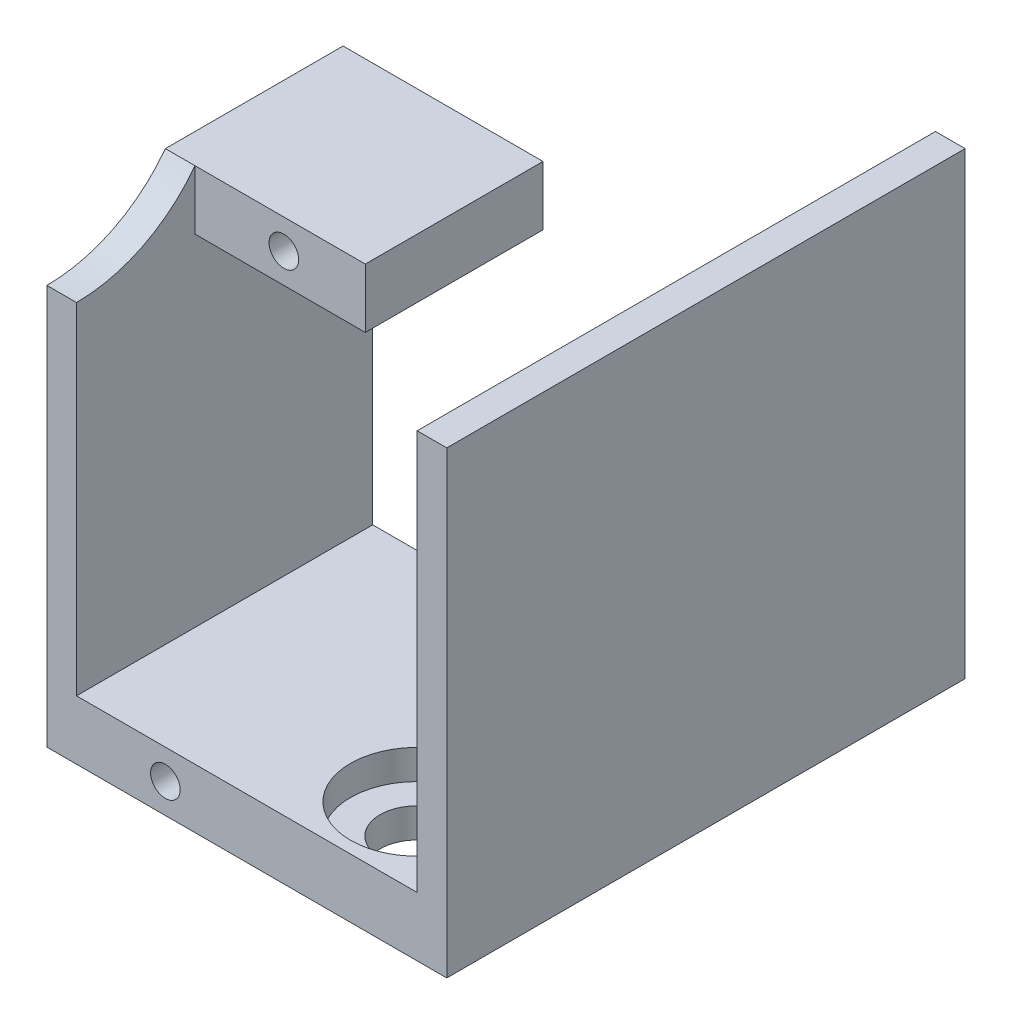
ISO-10303-21;
HEADER;
FILE_DESCRIPTION(('STEP AP214'),'2;1');
FILE_NAME('part.step','',(''),(''),'','','');
FILE_SCHEMA(('AUTOMOTIVE_DESIGN { 1 0 10303 214 1 1 1 1 }'));
ENDSEC;
DATA;
#1=APPLICATION_CONTEXT('core data for automotive mechanical design processes');
#2=APPLICATION_PROTOCOL_DEFINITION('international standard','automotive_design',2000,#1);
#3=PRODUCT_CONTEXT('',#1,'mechanical');
#4=PRODUCT('Part','Part','',(#3));
#5=PRODUCT_RELATED_PRODUCT_CATEGORY('part','',(#4));
#6=PRODUCT_DEFINITION_FORMATION('','',#4);
#7=PRODUCT_DEFINITION_CONTEXT('part definition',#1,'design');
#8=PRODUCT_DEFINITION('design','',#6,#7);
#9=PRODUCT_DEFINITION_SHAPE('','',#8);
#10=(LENGTH_UNIT() NAMED_UNIT(*) SI_UNIT(.MILLI.,.METRE.));
#11=(NAMED_UNIT(*) PLANE_ANGLE_UNIT() SI_UNIT($,.RADIAN.));
#12=(NAMED_UNIT(*) SI_UNIT($,.STERADIAN.) SOLID_ANGLE_UNIT());
#13=UNCERTAINTY_MEASURE_WITH_UNIT(LENGTH_MEASURE(1.E-05),#10,'distance_accuracy_value','');
#14=(GEOMETRIC_REPRESENTATION_CONTEXT(3) GLOBAL_UNCERTAINTY_ASSIGNED_CONTEXT((#13)) GLOBAL_UNIT_ASSIGNED_CONTEXT((#10,
#11,#12)) REPRESENTATION_CONTEXT('',''));
#15=CARTESIAN_POINT('',(0.,0.,0.));
#16=DIRECTION('',(0.,0.,1.));
#17=DIRECTION('',(1.,0.,0.));
#18=AXIS2_PLACEMENT_3D('',#15,#16,#17);
#19=CARTESIAN_POINT('',(0.,2.,0.));
#20=DIRECTION('',(0.,1.,0.));
#21=DIRECTION('',(0.,0.,1.));
#22=AXIS2_PLACEMENT_3D('',#19,#20,#21);
#23=PLANE('',#22);
#24=CARTESIAN_POINT('',(4.69669914110089,2.,4.6966991411009));
#25=DIRECTION('',(0.,1.,0.));
#26=DIRECTION('',(0.,0.,1.));
#27=AXIS2_PLACEMENT_3D('',#24,#25,#26);
#28=CIRCLE('',#27,4.5);
#29=CARTESIAN_POINT('',(4.69669914110089,2.,9.1966991411009));
#30=VERTEX_POINT('',#29);
#31=EDGE_CURVE('E315',#30,#30,#28,.F.);
#32=ORIENTED_EDGE('',*,*,#31,.F.);
#33=EDGE_LOOP('',(#32));
#34=FACE_BOUND('',#33,.T.);
#35=CARTESIAN_POINT('',(4.69669914110089,2.,4.6966991411009));
#36=DIRECTION('',(0.,1.,0.));
#37=DIRECTION('',(0.,0.,-1.));
#38=AXIS2_PLACEMENT_3D('',#35,#36,#37);
#39=CIRCLE('',#38,2.5);
#40=CARTESIAN_POINT('',(4.69669914110089,2.,2.19669914110089));
#41=VERTEX_POINT('',#40);
#42=EDGE_CURVE('E152',#41,#41,#39,.T.);
#43=ORIENTED_EDGE('',*,*,#42,.F.);
#44=EDGE_LOOP('',(#43));
#45=FACE_BOUND('',#44,.T.);
#46=ADVANCED_FACE('F47',(#34,#45),#23,.T.);
#47=CARTESIAN_POINT('',(4.69669914110093,2.,-4.69669914110093));
#48=DIRECTION('',(0.,1.,0.));
#49=DIRECTION('',(0.,0.,1.));
#50=AXIS2_PLACEMENT_3D('',#47,#48,#49);
#51=CIRCLE('',#50,4.5);
#52=CARTESIAN_POINT('',(4.69669914110093,2.,-0.196699141100929));
#53=VERTEX_POINT('',#52);
#54=EDGE_CURVE('E311',#53,#53,#51,.F.);
#55=ORIENTED_EDGE('',*,*,#54,.F.);
#56=EDGE_LOOP('',(#55));
#57=FACE_BOUND('',#56,.T.);
#58=CARTESIAN_POINT('',(4.69669914110093,2.,-4.69669914110093));
#59=DIRECTION('',(0.,1.,0.));
#60=DIRECTION('',(0.,0.,-1.));
#61=AXIS2_PLACEMENT_3D('',#58,#59,#60);
#62=CIRCLE('',#61,2.5);
#63=CARTESIAN_POINT('',(4.69669914110093,2.,-7.19669914110093));
#64=VERTEX_POINT('',#63);
#65=EDGE_CURVE('E293',#64,#64,#62,.T.);
#66=ORIENTED_EDGE('',*,*,#65,.F.);
#67=EDGE_LOOP('',(#66));
#68=FACE_BOUND('',#67,.T.);
#69=ADVANCED_FACE('F378',(#57,#68),#23,.T.);
#70=CARTESIAN_POINT('',(0.,0.,0.));
#71=DIRECTION('',(0.,1.,0.));
#72=DIRECTION('',(0.,0.,1.));
#73=AXIS2_PLACEMENT_3D('',#70,#71,#72);
#74=PLANE('',#73);
#75=DIRECTION('',(1.,0.,0.));
#76=VECTOR('',#75,1.);
#77=CARTESIAN_POINT('',(10.,0.,9.99999999999999));
#78=LINE('',#77,#76);
#79=CARTESIAN_POINT('',(-15.,0.,10.));
#80=VERTEX_POINT('',#79);
#81=CARTESIAN_POINT('',(12.,0.,9.99999999999999));
#82=VERTEX_POINT('',#81);
#83=EDGE_CURVE('E139',#80,#82,#78,.T.);
#84=ORIENTED_EDGE('',*,*,#83,.F.);
#85=DIRECTION('',(0.,0.,1.));
#86=VECTOR('',#85,1.);
#87=CARTESIAN_POINT('',(-15.,0.,-10.));
#88=LINE('',#87,#86);
#89=CARTESIAN_POINT('',(-15.,0.,-10.));
#90=VERTEX_POINT('',#89);
#91=EDGE_CURVE('E250',#90,#80,#88,.T.);
#92=ORIENTED_EDGE('',*,*,#91,.F.);
#93=DIRECTION('',(-1.,0.,0.));
#94=VECTOR('',#93,1.);
#95=CARTESIAN_POINT('',(10.,0.,-10.));
#96=LINE('',#95,#94);
#97=CARTESIAN_POINT('',(10.,0.,-10.));
#98=VERTEX_POINT('',#97);
#99=EDGE_CURVE('E151',#98,#90,#96,.T.);
#100=ORIENTED_EDGE('',*,*,#99,.F.);
#101=DIRECTION('',(0.,0.,-1.));
#102=VECTOR('',#101,1.);
#103=CARTESIAN_POINT('',(10.,0.,9.99999999999999));
#104=LINE('',#103,#102);
#105=CARTESIAN_POINT('',(10.,0.,-25.));
#106=VERTEX_POINT('',#105);
#107=EDGE_CURVE('E185',#98,#106,#104,.T.);
#108=ORIENTED_EDGE('',*,*,#107,.T.);
#109=DIRECTION('',(-1.,0.,0.));
#110=VECTOR('',#109,1.);
#111=CARTESIAN_POINT('',(12.,0.,-25.));
#112=LINE('',#111,#110);
#113=CARTESIAN_POINT('',(12.,0.,-25.));
#114=VERTEX_POINT('',#113);
#115=EDGE_CURVE('E159',#114,#106,#112,.T.);
#116=ORIENTED_EDGE('',*,*,#115,.F.);
#117=DIRECTION('',(0.,0.,-1.));
#118=VECTOR('',#117,1.);
#119=CARTESIAN_POINT('',(12.,0.,9.99999999999999));
#120=LINE('',#119,#118);
#121=EDGE_CURVE('E155',#82,#114,#120,.T.);
#122=ORIENTED_EDGE('',*,*,#121,.F.);
#123=EDGE_LOOP('',(#84,#92,#100,#108,#116,#122));
#124=FACE_BOUND('',#123,.T.);
#125=CARTESIAN_POINT('',(4.69669914110089,0.,4.6966991411009));
#126=DIRECTION('',(0.,1.,0.));
#127=DIRECTION('',(0.,0.,-1.));
#128=AXIS2_PLACEMENT_3D('',#125,#126,#127);
#129=CIRCLE('',#128,2.5);
#130=CARTESIAN_POINT('',(4.69669914110089,0.,2.19669914110089));
#131=VERTEX_POINT('',#130);
#132=EDGE_CURVE('E297',#131,#131,#129,.T.);
#133=ORIENTED_EDGE('',*,*,#132,.T.);
#134=EDGE_LOOP('',(#133));
#135=FACE_BOUND('',#134,.T.);
#136=CARTESIAN_POINT('',(4.69669914110093,0.,-4.69669914110093));
#137=DIRECTION('',(0.,1.,0.));
#138=DIRECTION('',(0.,0.,-1.));
#139=AXIS2_PLACEMENT_3D('',#136,#137,#138);
#140=CIRCLE('',#139,2.5);
#141=CARTESIAN_POINT('',(4.69669914110093,0.,-7.19669914110093));
#142=VERTEX_POINT('',#141);
#143=EDGE_CURVE('E292',#142,#142,#140,.T.);
#144=ORIENTED_EDGE('',*,*,#143,.T.);
#145=EDGE_LOOP('',(#144));
#146=FACE_BOUND('',#145,.T.);
#147=ADVANCED_FACE('F156',(#124,#135,#146),#74,.F.);
#148=CARTESIAN_POINT('',(10.,2.,9.99999999999999));
#149=DIRECTION('',(0.,0.,-1.));
#150=DIRECTION('',(-1.,0.,0.));
#151=AXIS2_PLACEMENT_3D('',#148,#149,#150);
#152=PLANE('',#151);
#153=CARTESIAN_POINT('',(-7.,2.,10.));
#154=DIRECTION('',(0.,0.,-1.));
#155=DIRECTION('',(-1.,0.,0.));
#156=AXIS2_PLACEMENT_3D('',#153,#154,#155);
#157=CIRCLE('',#156,1.);
#158=CARTESIAN_POINT('',(-8.,2.,10.));
#159=VERTEX_POINT('',#158);
#160=EDGE_CURVE('E241',#159,#159,#157,.F.);
#161=ORIENTED_EDGE('',*,*,#160,.F.);
#162=EDGE_LOOP('',(#161));
#163=FACE_BOUND('',#162,.T.);
#164=ORIENTED_EDGE('',*,*,#83,.T.);
#165=DIRECTION('',(0.,-1.,0.));
#166=VECTOR('',#165,1.);
#167=CARTESIAN_POINT('',(12.,0.,9.99999999999999));
#168=LINE('',#167,#166);
#169=CARTESIAN_POINT('',(12.,31.,9.99999999999999));
#170=VERTEX_POINT('',#169);
#171=EDGE_CURVE('E144',#170,#82,#168,.T.);
#172=ORIENTED_EDGE('',*,*,#171,.F.);
#173=DIRECTION('',(-1.,0.,0.));
#174=VECTOR('',#173,1.);
#175=CARTESIAN_POINT('',(12.,31.,9.99999999999999));
#176=LINE('',#175,#174);
#177=CARTESIAN_POINT('',(10.,31.,9.99999999999999));
#178=VERTEX_POINT('',#177);
#179=EDGE_CURVE('E180',#170,#178,#176,.T.);
#180=ORIENTED_EDGE('',*,*,#179,.T.);
#181=DIRECTION('',(0.,-1.,0.));
#182=VECTOR('',#181,1.);
#183=CARTESIAN_POINT('',(10.,0.,9.99999999999999));
#184=LINE('',#183,#182);
#185=CARTESIAN_POINT('',(10.,4.,9.99999999999999));
#186=VERTEX_POINT('',#185);
#187=EDGE_CURVE('E181',#178,#186,#184,.T.);
#188=ORIENTED_EDGE('',*,*,#187,.T.);
#189=DIRECTION('',(1.,0.,0.));
#190=VECTOR('',#189,1.);
#191=CARTESIAN_POINT('',(0.,4.,10.));
#192=LINE('',#191,#190);
#193=CARTESIAN_POINT('',(-13.,4.,10.));
#194=VERTEX_POINT('',#193);
#195=EDGE_CURVE('E285',#194,#186,#192,.T.);
#196=ORIENTED_EDGE('',*,*,#195,.F.);
#197=DIRECTION('',(0.,1.,0.));
#198=VECTOR('',#197,1.);
#199=CARTESIAN_POINT('',(-13.,0.,10.));
#200=LINE('',#199,#198);
#201=CARTESIAN_POINT('',(-13.,27.,10.));
#202=VERTEX_POINT('',#201);
#203=EDGE_CURVE('E260',#194,#202,#200,.T.);
#204=ORIENTED_EDGE('',*,*,#203,.T.);
#205=DIRECTION('',(1.,0.,0.));
#206=VECTOR('',#205,1.);
#207=CARTESIAN_POINT('',(-15.,27.,10.));
#208=LINE('',#207,#206);
#209=CARTESIAN_POINT('',(-15.,27.,10.));
#210=VERTEX_POINT('',#209);
#211=EDGE_CURVE('E256',#210,#202,#208,.T.);
#212=ORIENTED_EDGE('',*,*,#211,.F.);
#213=DIRECTION('',(0.,1.,0.));
#214=VECTOR('',#213,1.);
#215=CARTESIAN_POINT('',(-15.,0.,10.));
#216=LINE('',#215,#214);
#217=EDGE_CURVE('E146',#80,#210,#216,.T.);
#218=ORIENTED_EDGE('',*,*,#217,.F.);
#219=EDGE_LOOP('',(#164,#172,#180,#188,#196,#204,#212,#218));
#220=FACE_BOUND('',#219,.T.);
#221=ADVANCED_FACE('F141',(#163,#220),#152,.F.);
#222=CARTESIAN_POINT('',(10.,2.,-10.));
#223=DIRECTION('',(0.,0.,1.));
#224=DIRECTION('',(1.,0.,0.));
#225=AXIS2_PLACEMENT_3D('',#222,#223,#224);
#226=PLANE('',#225);
#227=CARTESIAN_POINT('',(-7.,29.,-10.));
#228=DIRECTION('',(0.,0.,1.));
#229=DIRECTION('',(-1.,0.,0.));
#230=AXIS2_PLACEMENT_3D('',#227,#228,#229);
#231=CIRCLE('',#230,1.);
#232=CARTESIAN_POINT('',(-8.,29.,-10.));
#233=VERTEX_POINT('',#232);
#234=EDGE_CURVE('E198',#233,#233,#231,.T.);
#235=ORIENTED_EDGE('',*,*,#234,.T.);
#236=EDGE_LOOP('',(#235));
#237=FACE_BOUND('',#236,.T.);
#238=CARTESIAN_POINT('',(-7.,2.,-10.));
#239=DIRECTION('',(0.,0.,-1.));
#240=DIRECTION('',(-1.,0.,0.));
#241=AXIS2_PLACEMENT_3D('',#238,#239,#240);
#242=CIRCLE('',#241,1.);
#243=CARTESIAN_POINT('',(-8.,2.,-10.));
#244=VERTEX_POINT('',#243);
#245=EDGE_CURVE('E237',#244,#244,#242,.T.);
#246=ORIENTED_EDGE('',*,*,#245,.F.);
#247=EDGE_LOOP('',(#246));
#248=FACE_BOUND('',#247,.T.);
#249=ORIENTED_EDGE('',*,*,#99,.T.);
#250=DIRECTION('',(0.,-1.,0.));
#251=VECTOR('',#250,1.);
#252=CARTESIAN_POINT('',(-15.,0.,-10.));
#253=LINE('',#252,#251);
#254=CARTESIAN_POINT('',(-15.,31.,-10.));
#255=VERTEX_POINT('',#254);
#256=EDGE_CURVE('E246',#255,#90,#253,.T.);
#257=ORIENTED_EDGE('',*,*,#256,.F.);
#258=DIRECTION('',(-1.,0.,0.));
#259=VECTOR('',#258,1.);
#260=CARTESIAN_POINT('',(-15.,31.,-10.));
#261=LINE('',#260,#259);
#262=CARTESIAN_POINT('',(-1.5,31.,-10.));
#263=VERTEX_POINT('',#262);
#264=EDGE_CURVE('E216',#263,#255,#261,.T.);
#265=ORIENTED_EDGE('',*,*,#264,.F.);
#266=DIRECTION('',(0.,-1.,0.));
#267=VECTOR('',#266,1.);
#268=CARTESIAN_POINT('',(-1.5,31.,-10.));
#269=LINE('',#268,#267);
#270=CARTESIAN_POINT('',(-1.5,27.,-10.));
#271=VERTEX_POINT('',#270);
#272=EDGE_CURVE('E220',#263,#271,#269,.T.);
#273=ORIENTED_EDGE('',*,*,#272,.T.);
#274=DIRECTION('',(-1.,0.,0.));
#275=VECTOR('',#274,1.);
#276=CARTESIAN_POINT('',(-15.,27.,-10.));
#277=LINE('',#276,#275);
#278=CARTESIAN_POINT('',(-13.,27.,-10.));
#279=VERTEX_POINT('',#278);
#280=EDGE_CURVE('E208',#271,#279,#277,.T.);
#281=ORIENTED_EDGE('',*,*,#280,.T.);
#282=DIRECTION('',(0.,-1.,0.));
#283=VECTOR('',#282,1.);
#284=CARTESIAN_POINT('',(-13.,0.,-10.));
#285=LINE('',#284,#283);
#286=CARTESIAN_POINT('',(-13.,4.,-10.));
#287=VERTEX_POINT('',#286);
#288=EDGE_CURVE('E245',#279,#287,#285,.T.);
#289=ORIENTED_EDGE('',*,*,#288,.T.);
#290=DIRECTION('',(-1.,0.,0.));
#291=VECTOR('',#290,1.);
#292=CARTESIAN_POINT('',(0.,4.,-10.));
#293=LINE('',#292,#291);
#294=CARTESIAN_POINT('',(10.,4.,-10.));
#295=VERTEX_POINT('',#294);
#296=EDGE_CURVE('E281',#295,#287,#293,.T.);
#297=ORIENTED_EDGE('',*,*,#296,.F.);
#298=DIRECTION('',(0.,-1.,0.));
#299=VECTOR('',#298,1.);
#300=CARTESIAN_POINT('',(10.,2.,-10.));
#301=LINE('',#300,#299);
#302=EDGE_CURVE('E70',#295,#98,#301,.T.);
#303=ORIENTED_EDGE('',*,*,#302,.T.);
#304=EDGE_LOOP('',(#249,#257,#265,#273,#281,#289,#297,#303));
#305=FACE_BOUND('',#304,.T.);
#306=ADVANCED_FACE('F340',(#237,#248,#305),#226,.F.);
#307=CARTESIAN_POINT('',(4.69669914110089,2.,4.6966991411009));
#308=DIRECTION('',(0.,-1.,0.));
#309=DIRECTION('',(0.,0.,-1.));
#310=AXIS2_PLACEMENT_3D('',#307,#308,#309);
#311=CYLINDRICAL_SURFACE('',#310,2.5);
#312=ORIENTED_EDGE('',*,*,#42,.T.);
#313=EDGE_LOOP('',(#312));
#314=FACE_BOUND('',#313,.T.);
#315=ORIENTED_EDGE('',*,*,#132,.F.);
#316=EDGE_LOOP('',(#315));
#317=FACE_BOUND('',#316,.T.);
#318=ADVANCED_FACE('F390',(#314,#317),#311,.F.);
#319=CARTESIAN_POINT('',(4.69669914110093,2.,-4.69669914110093));
#320=DIRECTION('',(0.,-1.,0.));
#321=DIRECTION('',(0.,0.,-1.));
#322=AXIS2_PLACEMENT_3D('',#319,#320,#321);
#323=CYLINDRICAL_SURFACE('',#322,2.5);
#324=ORIENTED_EDGE('',*,*,#65,.T.);
#325=EDGE_LOOP('',(#324));
#326=FACE_BOUND('',#325,.T.);
#327=ORIENTED_EDGE('',*,*,#143,.F.);
#328=EDGE_LOOP('',(#327));
#329=FACE_BOUND('',#328,.T.);
#330=ADVANCED_FACE('F423',(#326,#329),#323,.F.);
#331=CARTESIAN_POINT('',(4.69669914110089,4.,4.6966991411009));
#332=DIRECTION('',(0.,-1.,0.));
#333=DIRECTION('',(0.,0.,-1.));
#334=AXIS2_PLACEMENT_3D('',#331,#332,#333);
#335=CYLINDRICAL_SURFACE('',#334,4.5);
#336=CARTESIAN_POINT('',(4.69669914110089,4.,4.6966991411009));
#337=DIRECTION('',(0.,1.,0.));
#338=DIRECTION('',(0.,0.,1.));
#339=AXIS2_PLACEMENT_3D('',#336,#337,#338);
#340=CIRCLE('',#339,4.5);
#341=CARTESIAN_POINT('',(4.69669914110089,4.,9.1966991411009));
#342=VERTEX_POINT('',#341);
#343=EDGE_CURVE('E277',#342,#342,#340,.T.);
#344=ORIENTED_EDGE('',*,*,#343,.T.);
#345=EDGE_LOOP('',(#344));
#346=FACE_BOUND('',#345,.T.);
#347=ORIENTED_EDGE('',*,*,#31,.T.);
#348=EDGE_LOOP('',(#347));
#349=FACE_BOUND('',#348,.T.);
#350=ADVANCED_FACE('F420',(#346,#349),#335,.F.);
#351=CARTESIAN_POINT('',(4.69669914110093,4.,-4.69669914110093));
#352=DIRECTION('',(0.,-1.,0.));
#353=DIRECTION('',(0.,0.,-1.));
#354=AXIS2_PLACEMENT_3D('',#351,#352,#353);
#355=CYLINDRICAL_SURFACE('',#354,4.5);
#356=CARTESIAN_POINT('',(4.69669914110093,4.,-4.69669914110093));
#357=DIRECTION('',(0.,1.,0.));
#358=DIRECTION('',(0.,0.,1.));
#359=AXIS2_PLACEMENT_3D('',#356,#357,#358);
#360=CIRCLE('',#359,4.5);
#361=CARTESIAN_POINT('',(4.69669914110093,4.,-0.196699141100929));
#362=VERTEX_POINT('',#361);
#363=EDGE_CURVE('E273',#362,#362,#360,.T.);
#364=ORIENTED_EDGE('',*,*,#363,.T.);
#365=EDGE_LOOP('',(#364));
#366=FACE_BOUND('',#365,.T.);
#367=ORIENTED_EDGE('',*,*,#54,.T.);
#368=EDGE_LOOP('',(#367));
#369=FACE_BOUND('',#368,.T.);
#370=ADVANCED_FACE('F418',(#366,#369),#355,.F.);
#371=CARTESIAN_POINT('',(0.,4.,0.));
#372=DIRECTION('',(0.,1.,0.));
#373=DIRECTION('',(0.,0.,1.));
#374=AXIS2_PLACEMENT_3D('',#371,#372,#373);
#375=PLANE('',#374);
#376=ORIENTED_EDGE('',*,*,#363,.F.);
#377=EDGE_LOOP('',(#376));
#378=FACE_BOUND('',#377,.T.);
#379=ORIENTED_EDGE('',*,*,#343,.F.);
#380=EDGE_LOOP('',(#379));
#381=FACE_BOUND('',#380,.T.);
#382=ORIENTED_EDGE('',*,*,#296,.T.);
#383=DIRECTION('',(0.,0.,1.));
#384=VECTOR('',#383,1.);
#385=CARTESIAN_POINT('',(-13.,4.,10.));
#386=LINE('',#385,#384);
#387=EDGE_CURVE('E269',#287,#194,#386,.T.);
#388=ORIENTED_EDGE('',*,*,#387,.T.);
#389=ORIENTED_EDGE('',*,*,#195,.T.);
#390=DIRECTION('',(0.,0.,-1.));
#391=VECTOR('',#390,1.);
#392=CARTESIAN_POINT('',(10.,4.,0.));
#393=LINE('',#392,#391);
#394=EDGE_CURVE('E289',#186,#295,#393,.T.);
#395=ORIENTED_EDGE('',*,*,#394,.T.);
#396=EDGE_LOOP('',(#382,#388,#389,#395));
#397=FACE_BOUND('',#396,.T.);
#398=ADVANCED_FACE('F353',(#378,#381,#397),#375,.T.);
#399=CARTESIAN_POINT('',(-13.,0.,0.));
#400=DIRECTION('',(1.,0.,0.));
#401=DIRECTION('',(0.,0.,-1.));
#402=AXIS2_PLACEMENT_3D('',#399,#400,#401);
#403=PLANE('',#402);
#404=ORIENTED_EDGE('',*,*,#387,.F.);
#405=ORIENTED_EDGE('',*,*,#288,.F.);
#406=DIRECTION('',(0.,0.,-1.));
#407=VECTOR('',#406,1.);
#408=CARTESIAN_POINT('',(-13.,27.,-10.));
#409=LINE('',#408,#407);
#410=CARTESIAN_POINT('',(-13.,27.,2.));
#411=VERTEX_POINT('',#410);
#412=EDGE_CURVE('E251',#411,#279,#409,.T.);
#413=ORIENTED_EDGE('',*,*,#412,.F.);
#414=DIRECTION('',(0.,-1.,0.));
#415=VECTOR('',#414,1.);
#416=CARTESIAN_POINT('',(-13.,31.,2.));
#417=LINE('',#416,#415);
#418=CARTESIAN_POINT('',(-13.,31.,2.));
#419=VERTEX_POINT('',#418);
#420=EDGE_CURVE('E319',#419,#411,#417,.T.);
#421=ORIENTED_EDGE('',*,*,#420,.F.);
#422=CARTESIAN_POINT('',(-13.,37.,10.));
#423=DIRECTION('',(1.,0.,0.));
#424=DIRECTION('',(0.,0.,-1.));
#425=AXIS2_PLACEMENT_3D('',#422,#423,#424);
#426=CIRCLE('',#425,10.);
#427=EDGE_CURVE('E56',#419,#202,#426,.F.);
#428=ORIENTED_EDGE('',*,*,#427,.T.);
#429=ORIENTED_EDGE('',*,*,#203,.F.);
#430=EDGE_LOOP('',(#404,#405,#413,#421,#428,#429));
#431=FACE_BOUND('',#430,.T.);
#432=ADVANCED_FACE('F326',(#431),#403,.T.);
#433=CARTESIAN_POINT('',(-15.,0.,0.));
#434=DIRECTION('',(1.,0.,0.));
#435=DIRECTION('',(0.,0.,-1.));
#436=AXIS2_PLACEMENT_3D('',#433,#434,#435);
#437=PLANE('',#436);
#438=ORIENTED_EDGE('',*,*,#256,.T.);
#439=ORIENTED_EDGE('',*,*,#91,.T.);
#440=ORIENTED_EDGE('',*,*,#217,.T.);
#441=CARTESIAN_POINT('',(-15.,37.,10.));
#442=DIRECTION('',(1.,0.,0.));
#443=DIRECTION('',(0.,0.,-1.));
#444=AXIS2_PLACEMENT_3D('',#441,#442,#443);
#445=CIRCLE('',#444,10.);
#446=CARTESIAN_POINT('',(-15.,31.,2.));
#447=VERTEX_POINT('',#446);
#448=EDGE_CURVE('E11',#210,#447,#445,.T.);
#449=ORIENTED_EDGE('',*,*,#448,.T.);
#450=DIRECTION('',(0.,0.,1.));
#451=VECTOR('',#450,1.);
#452=CARTESIAN_POINT('',(-15.,31.,-10.));
#453=LINE('',#452,#451);
#454=EDGE_CURVE('E203',#255,#447,#453,.T.);
#455=ORIENTED_EDGE('',*,*,#454,.F.);
#456=EDGE_LOOP('',(#438,#439,#440,#449,#455));
#457=FACE_BOUND('',#456,.T.);
#458=ADVANCED_FACE('F333',(#457),#437,.F.);
#459=CARTESIAN_POINT('',(-7.,2.,12.8284271247462));
#460=DIRECTION('',(0.,0.,-1.));
#461=DIRECTION('',(-1.,0.,0.));
#462=AXIS2_PLACEMENT_3D('',#459,#460,#461);
#463=CYLINDRICAL_SURFACE('',#462,1.);
#464=ORIENTED_EDGE('',*,*,#160,.T.);
#465=EDGE_LOOP('',(#464));
#466=FACE_BOUND('',#465,.T.);
#467=ORIENTED_EDGE('',*,*,#245,.T.);
#468=EDGE_LOOP('',(#467));
#469=FACE_BOUND('',#468,.T.);
#470=ADVANCED_FACE('F402',(#466,#469),#463,.F.);
#471=CARTESIAN_POINT('',(0.,27.,0.));
#472=DIRECTION('',(0.,1.,0.));
#473=DIRECTION('',(0.,0.,1.));
#474=AXIS2_PLACEMENT_3D('',#471,#472,#473);
#475=PLANE('',#474);
#476=DIRECTION('',(1.,0.,0.));
#477=VECTOR('',#476,1.);
#478=CARTESIAN_POINT('',(-15.,27.,2.));
#479=LINE('',#478,#477);
#480=CARTESIAN_POINT('',(-1.5,27.,2.));
#481=VERTEX_POINT('',#480);
#482=EDGE_CURVE('E221',#411,#481,#479,.T.);
#483=ORIENTED_EDGE('',*,*,#482,.F.);
#484=ORIENTED_EDGE('',*,*,#412,.T.);
#485=ORIENTED_EDGE('',*,*,#280,.F.);
#486=DIRECTION('',(0.,0.,-1.));
#487=VECTOR('',#486,1.);
#488=CARTESIAN_POINT('',(-1.5,27.,-10.));
#489=LINE('',#488,#487);
#490=EDGE_CURVE('E224',#481,#271,#489,.T.);
#491=ORIENTED_EDGE('',*,*,#490,.F.);
#492=EDGE_LOOP('',(#483,#484,#485,#491));
#493=FACE_BOUND('',#492,.T.);
#494=ADVANCED_FACE('F358',(#493),#475,.F.);
#495=CARTESIAN_POINT('',(-15.,31.,2.));
#496=DIRECTION('',(0.,0.,-1.));
#497=DIRECTION('',(-1.,0.,0.));
#498=AXIS2_PLACEMENT_3D('',#495,#496,#497);
#499=PLANE('',#498);
#500=CARTESIAN_POINT('',(-7.,29.,2.));
#501=DIRECTION('',(0.,0.,-1.));
#502=DIRECTION('',(-1.,0.,0.));
#503=AXIS2_PLACEMENT_3D('',#500,#501,#502);
#504=CIRCLE('',#503,1.);
#505=CARTESIAN_POINT('',(-8.,29.,2.));
#506=VERTEX_POINT('',#505);
#507=EDGE_CURVE('E202',#506,#506,#504,.F.);
#508=ORIENTED_EDGE('',*,*,#507,.F.);
#509=EDGE_LOOP('',(#508));
#510=FACE_BOUND('',#509,.T.);
#511=DIRECTION('',(1.,0.,0.));
#512=VECTOR('',#511,1.);
#513=CARTESIAN_POINT('',(-15.,31.,2.));
#514=LINE('',#513,#512);
#515=CARTESIAN_POINT('',(-1.5,31.,2.));
#516=VERTEX_POINT('',#515);
#517=EDGE_CURVE('E207',#419,#516,#514,.T.);
#518=ORIENTED_EDGE('',*,*,#517,.F.);
#519=ORIENTED_EDGE('',*,*,#420,.T.);
#520=ORIENTED_EDGE('',*,*,#482,.T.);
#521=DIRECTION('',(0.,-1.,0.));
#522=VECTOR('',#521,1.);
#523=CARTESIAN_POINT('',(-1.5,31.,2.));
#524=LINE('',#523,#522);
#525=EDGE_CURVE('E233',#516,#481,#524,.T.);
#526=ORIENTED_EDGE('',*,*,#525,.F.);
#527=EDGE_LOOP('',(#518,#519,#520,#526));
#528=FACE_BOUND('',#527,.T.);
#529=ADVANCED_FACE('F361',(#510,#528),#499,.F.);
#530=CARTESIAN_POINT('',(-1.5,31.,-10.));
#531=DIRECTION('',(-1.,0.,0.));
#532=DIRECTION('',(0.,0.,1.));
#533=AXIS2_PLACEMENT_3D('',#530,#531,#532);
#534=PLANE('',#533);
#535=ORIENTED_EDGE('',*,*,#490,.T.);
#536=ORIENTED_EDGE('',*,*,#272,.F.);
#537=DIRECTION('',(0.,0.,-1.));
#538=VECTOR('',#537,1.);
#539=CARTESIAN_POINT('',(-1.5,31.,-10.));
#540=LINE('',#539,#538);
#541=EDGE_CURVE('E213',#516,#263,#540,.T.);
#542=ORIENTED_EDGE('',*,*,#541,.F.);
#543=ORIENTED_EDGE('',*,*,#525,.T.);
#544=EDGE_LOOP('',(#535,#536,#542,#543));
#545=FACE_BOUND('',#544,.T.);
#546=ADVANCED_FACE('F363',(#545),#534,.F.);
#547=CARTESIAN_POINT('',(0.,31.,0.));
#548=DIRECTION('',(0.,1.,0.));
#549=DIRECTION('',(0.,0.,1.));
#550=AXIS2_PLACEMENT_3D('',#547,#548,#549);
#551=PLANE('',#550);
#552=ORIENTED_EDGE('',*,*,#454,.T.);
#553=EDGE_CURVE('E209',#447,#419,#514,.T.);
#554=ORIENTED_EDGE('',*,*,#553,.T.);
#555=ORIENTED_EDGE('',*,*,#517,.T.);
#556=ORIENTED_EDGE('',*,*,#541,.T.);
#557=ORIENTED_EDGE('',*,*,#264,.T.);
#558=EDGE_LOOP('',(#552,#554,#555,#556,#557));
#559=FACE_BOUND('',#558,.T.);
#560=ADVANCED_FACE('F335',(#559),#551,.T.);
#561=CARTESIAN_POINT('',(-7.,29.,12.8284271247462));
#562=DIRECTION('',(0.,0.,-1.));
#563=DIRECTION('',(-1.,0.,0.));
#564=AXIS2_PLACEMENT_3D('',#561,#562,#563);
#565=CYLINDRICAL_SURFACE('',#564,1.);
#566=ORIENTED_EDGE('',*,*,#234,.F.);
#567=EDGE_LOOP('',(#566));
#568=FACE_BOUND('',#567,.T.);
#569=ORIENTED_EDGE('',*,*,#507,.T.);
#570=EDGE_LOOP('',(#569));
#571=FACE_BOUND('',#570,.T.);
#572=ADVANCED_FACE('F371',(#568,#571),#565,.F.);
#573=CARTESIAN_POINT('',(-15.,37.,10.));
#574=DIRECTION('',(1.,0.,0.));
#575=DIRECTION('',(0.,0.,-1.));
#576=AXIS2_PLACEMENT_3D('',#573,#574,#575);
#577=CYLINDRICAL_SURFACE('',#576,10.);
#578=ORIENTED_EDGE('',*,*,#448,.F.);
#579=ORIENTED_EDGE('',*,*,#211,.T.);
#580=ORIENTED_EDGE('',*,*,#427,.F.);
#581=ORIENTED_EDGE('',*,*,#553,.F.);
#582=EDGE_LOOP('',(#578,#579,#580,#581));
#583=FACE_BOUND('',#582,.T.);
#584=ADVANCED_FACE('F49',(#583),#577,.F.);
#585=CARTESIAN_POINT('',(10.,0.,0.));
#586=DIRECTION('',(-1.,0.,0.));
#587=DIRECTION('',(0.,0.,1.));
#588=AXIS2_PLACEMENT_3D('',#585,#586,#587);
#589=PLANE('',#588);
#590=ORIENTED_EDGE('',*,*,#302,.F.);
#591=ORIENTED_EDGE('',*,*,#394,.F.);
#592=ORIENTED_EDGE('',*,*,#187,.F.);
#593=DIRECTION('',(0.,0.,1.));
#594=VECTOR('',#593,1.);
#595=CARTESIAN_POINT('',(10.,31.,9.99999999999999));
#596=LINE('',#595,#594);
#597=CARTESIAN_POINT('',(10.,31.,-25.));
#598=VERTEX_POINT('',#597);
#599=EDGE_CURVE('E170',#598,#178,#596,.T.);
#600=ORIENTED_EDGE('',*,*,#599,.F.);
#601=DIRECTION('',(0.,1.,0.));
#602=VECTOR('',#601,1.);
#603=CARTESIAN_POINT('',(10.,0.,-25.));
#604=LINE('',#603,#602);
#605=EDGE_CURVE('E173',#106,#598,#604,.T.);
#606=ORIENTED_EDGE('',*,*,#605,.F.);
#607=ORIENTED_EDGE('',*,*,#107,.F.);
#608=EDGE_LOOP('',(#590,#591,#592,#600,#606,#607));
#609=FACE_BOUND('',#608,.T.);
#610=ADVANCED_FACE('F348',(#609),#589,.T.);
#611=CARTESIAN_POINT('',(12.,0.,-25.));
#612=DIRECTION('',(0.,0.,1.));
#613=DIRECTION('',(1.,0.,0.));
#614=AXIS2_PLACEMENT_3D('',#611,#612,#613);
#615=PLANE('',#614);
#616=ORIENTED_EDGE('',*,*,#605,.T.);
#617=DIRECTION('',(-1.,0.,0.));
#618=VECTOR('',#617,1.);
#619=CARTESIAN_POINT('',(12.,31.,-25.));
#620=LINE('',#619,#618);
#621=CARTESIAN_POINT('',(12.,31.,-25.));
#622=VERTEX_POINT('',#621);
#623=EDGE_CURVE('E192',#622,#598,#620,.T.);
#624=ORIENTED_EDGE('',*,*,#623,.F.);
#625=DIRECTION('',(0.,1.,0.));
#626=VECTOR('',#625,1.);
#627=CARTESIAN_POINT('',(12.,0.,-25.));
#628=LINE('',#627,#626);
#629=EDGE_CURVE('E163',#114,#622,#628,.T.);
#630=ORIENTED_EDGE('',*,*,#629,.F.);
#631=ORIENTED_EDGE('',*,*,#115,.T.);
#632=EDGE_LOOP('',(#616,#624,#630,#631));
#633=FACE_BOUND('',#632,.T.);
#634=ADVANCED_FACE('F345',(#633),#615,.F.);
#635=CARTESIAN_POINT('',(12.,31.,9.99999999999999));
#636=DIRECTION('',(0.,-1.,0.));
#637=DIRECTION('',(0.,0.,-1.));
#638=AXIS2_PLACEMENT_3D('',#635,#636,#637);
#639=PLANE('',#638);
#640=ORIENTED_EDGE('',*,*,#599,.T.);
#641=ORIENTED_EDGE('',*,*,#179,.F.);
#642=DIRECTION('',(0.,0.,1.));
#643=VECTOR('',#642,1.);
#644=CARTESIAN_POINT('',(12.,31.,9.99999999999999));
#645=LINE('',#644,#643);
#646=EDGE_CURVE('E167',#622,#170,#645,.T.);
#647=ORIENTED_EDGE('',*,*,#646,.F.);
#648=ORIENTED_EDGE('',*,*,#623,.T.);
#649=EDGE_LOOP('',(#640,#641,#647,#648));
#650=FACE_BOUND('',#649,.T.);
#651=ADVANCED_FACE('F351',(#650),#639,.F.);
#652=CARTESIAN_POINT('',(12.,0.,0.));
#653=DIRECTION('',(-1.,0.,0.));
#654=DIRECTION('',(0.,0.,1.));
#655=AXIS2_PLACEMENT_3D('',#652,#653,#654);
#656=PLANE('',#655);
#657=ORIENTED_EDGE('',*,*,#171,.T.);
#658=ORIENTED_EDGE('',*,*,#121,.T.);
#659=ORIENTED_EDGE('',*,*,#629,.T.);
#660=ORIENTED_EDGE('',*,*,#646,.T.);
#661=EDGE_LOOP('',(#657,#658,#659,#660));
#662=FACE_BOUND('',#661,.T.);
#663=ADVANCED_FACE('F165',(#662),#656,.F.);
#664=CLOSED_SHELL('',(#46,#69,#147,#221,#306,#318,#330,#350,#370,#398,#432,#458,#470,#494,#529,
#546,#560,#572,#584,#610,#634,#651,#663));
#665=MANIFOLD_SOLID_BREP('B2',#664);
#666=ADVANCED_BREP_SHAPE_REPRESENTATION('',(#18,#665),#14);
#667=SHAPE_DEFINITION_REPRESENTATION(#9,#666);
ENDSEC;
END-ISO-10303-21;
